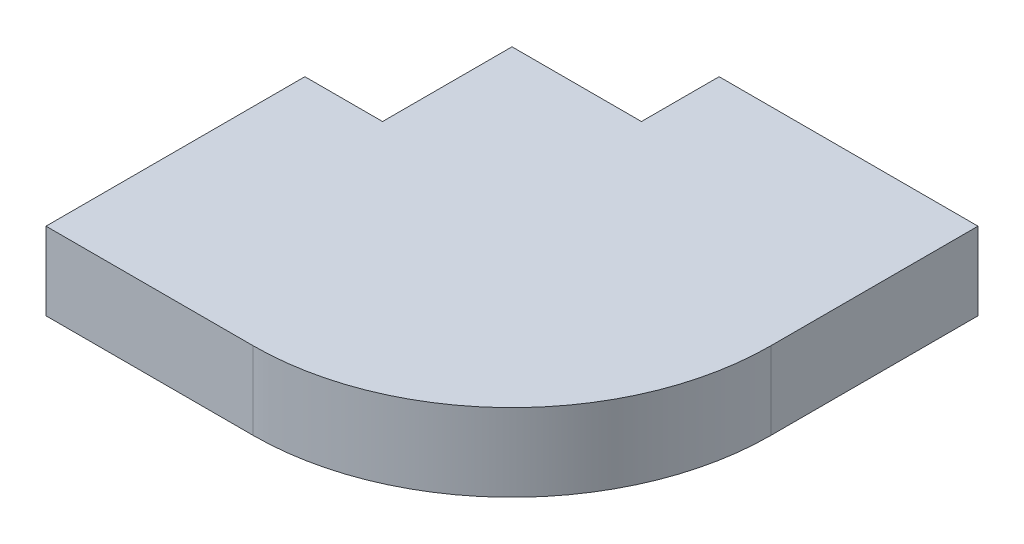
ISO-10303-21;
HEADER;
FILE_DESCRIPTION(('STEP AP214'),'2;1');
FILE_NAME('part.step','',(''),(''),'','','');
FILE_SCHEMA(('AUTOMOTIVE_DESIGN { 1 0 10303 214 1 1 1 1 }'));
ENDSEC;
DATA;
#1=APPLICATION_CONTEXT('core data for automotive mechanical design processes');
#2=APPLICATION_PROTOCOL_DEFINITION('international standard','automotive_design',2000,#1);
#3=PRODUCT_CONTEXT('',#1,'mechanical');
#4=PRODUCT('Part','Part','',(#3));
#5=PRODUCT_RELATED_PRODUCT_CATEGORY('part','',(#4));
#6=PRODUCT_DEFINITION_FORMATION('','',#4);
#7=PRODUCT_DEFINITION_CONTEXT('part definition',#1,'design');
#8=PRODUCT_DEFINITION('design','',#6,#7);
#9=PRODUCT_DEFINITION_SHAPE('','',#8);
#10=(LENGTH_UNIT() NAMED_UNIT(*) SI_UNIT(.MILLI.,.METRE.));
#11=(NAMED_UNIT(*) PLANE_ANGLE_UNIT() SI_UNIT($,.RADIAN.));
#12=(NAMED_UNIT(*) SI_UNIT($,.STERADIAN.) SOLID_ANGLE_UNIT());
#13=UNCERTAINTY_MEASURE_WITH_UNIT(LENGTH_MEASURE(1.E-05),#10,'distance_accuracy_value','');
#14=(GEOMETRIC_REPRESENTATION_CONTEXT(3) GLOBAL_UNCERTAINTY_ASSIGNED_CONTEXT((#13)) GLOBAL_UNIT_ASSIGNED_CONTEXT((#10,
#11,#12)) REPRESENTATION_CONTEXT('',''));
#15=CARTESIAN_POINT('',(0.,0.,0.));
#16=DIRECTION('',(0.,0.,1.));
#17=DIRECTION('',(1.,0.,0.));
#18=AXIS2_PLACEMENT_3D('',#15,#16,#17);
#19=CARTESIAN_POINT('',(-2.5,3.,-10.5));
#20=DIRECTION('',(0.,0.,1.));
#21=DIRECTION('',(1.,0.,0.));
#22=AXIS2_PLACEMENT_3D('',#19,#20,#21);
#23=PLANE('',#22);
#24=DIRECTION('',(-1.,0.,0.));
#25=VECTOR('',#24,1.);
#26=CARTESIAN_POINT('',(-2.5,0.,-10.5));
#27=LINE('',#26,#25);
#28=CARTESIAN_POINT('',(7.5,0.,-10.5));
#29=VERTEX_POINT('',#28);
#30=CARTESIAN_POINT('',(-2.5,0.,-10.5));
#31=VERTEX_POINT('',#30);
#32=EDGE_CURVE('E139',#29,#31,#27,.T.);
#33=ORIENTED_EDGE('',*,*,#32,.T.);
#34=DIRECTION('',(0.,-1.,0.));
#35=VECTOR('',#34,1.);
#36=CARTESIAN_POINT('',(-2.5,3.,-10.5));
#37=LINE('',#36,#35);
#38=CARTESIAN_POINT('',(-2.5,3.,-10.5));
#39=VERTEX_POINT('',#38);
#40=EDGE_CURVE('E41',#39,#31,#37,.T.);
#41=ORIENTED_EDGE('',*,*,#40,.F.);
#42=DIRECTION('',(-1.,0.,0.));
#43=VECTOR('',#42,1.);
#44=CARTESIAN_POINT('',(-2.5,3.,-10.5));
#45=LINE('',#44,#43);
#46=CARTESIAN_POINT('',(7.5,3.,-10.5));
#47=VERTEX_POINT('',#46);
#48=EDGE_CURVE('E95',#47,#39,#45,.T.);
#49=ORIENTED_EDGE('',*,*,#48,.F.);
#50=DIRECTION('',(0.,-1.,0.));
#51=VECTOR('',#50,1.);
#52=CARTESIAN_POINT('',(7.5,3.,-10.5));
#53=LINE('',#52,#51);
#54=EDGE_CURVE('E11',#47,#29,#53,.T.);
#55=ORIENTED_EDGE('',*,*,#54,.T.);
#56=EDGE_LOOP('',(#33,#41,#49,#55));
#57=FACE_BOUND('',#56,.T.);
#58=ADVANCED_FACE('F33',(#57),#23,.F.);
#59=CARTESIAN_POINT('',(-2.5,3.,-7.5));
#60=DIRECTION('',(1.,0.,0.));
#61=DIRECTION('',(0.,0.,-1.));
#62=AXIS2_PLACEMENT_3D('',#59,#60,#61);
#63=PLANE('',#62);
#64=DIRECTION('',(0.,0.,1.));
#65=VECTOR('',#64,1.);
#66=CARTESIAN_POINT('',(-2.5,0.,-7.5));
#67=LINE('',#66,#65);
#68=CARTESIAN_POINT('',(-2.5,0.,-7.5));
#69=VERTEX_POINT('',#68);
#70=EDGE_CURVE('E141',#31,#69,#67,.T.);
#71=ORIENTED_EDGE('',*,*,#70,.T.);
#72=DIRECTION('',(0.,-1.,0.));
#73=VECTOR('',#72,1.);
#74=CARTESIAN_POINT('',(-2.5,3.,-7.5));
#75=LINE('',#74,#73);
#76=CARTESIAN_POINT('',(-2.5,3.,-7.5));
#77=VERTEX_POINT('',#76);
#78=EDGE_CURVE('E163',#77,#69,#75,.T.);
#79=ORIENTED_EDGE('',*,*,#78,.F.);
#80=DIRECTION('',(0.,0.,1.));
#81=VECTOR('',#80,1.);
#82=CARTESIAN_POINT('',(-2.5,3.,-7.5));
#83=LINE('',#82,#81);
#84=EDGE_CURVE('E171',#39,#77,#83,.T.);
#85=ORIENTED_EDGE('',*,*,#84,.F.);
#86=ORIENTED_EDGE('',*,*,#40,.T.);
#87=EDGE_LOOP('',(#71,#79,#85,#86));
#88=FACE_BOUND('',#87,.T.);
#89=ADVANCED_FACE('F169',(#88),#63,.F.);
#90=CARTESIAN_POINT('',(-7.5,3.,-7.5));
#91=DIRECTION('',(0.,0.,1.));
#92=DIRECTION('',(1.,0.,0.));
#93=AXIS2_PLACEMENT_3D('',#90,#91,#92);
#94=PLANE('',#93);
#95=DIRECTION('',(-1.,0.,0.));
#96=VECTOR('',#95,1.);
#97=CARTESIAN_POINT('',(-7.5,0.,-7.5));
#98=LINE('',#97,#96);
#99=CARTESIAN_POINT('',(-7.5,0.,-7.5));
#100=VERTEX_POINT('',#99);
#101=EDGE_CURVE('E143',#69,#100,#98,.T.);
#102=ORIENTED_EDGE('',*,*,#101,.T.);
#103=DIRECTION('',(0.,-1.,0.));
#104=VECTOR('',#103,1.);
#105=CARTESIAN_POINT('',(-7.5,3.,-7.5));
#106=LINE('',#105,#104);
#107=CARTESIAN_POINT('',(-7.5,3.,-7.5));
#108=VERTEX_POINT('',#107);
#109=EDGE_CURVE('E160',#108,#100,#106,.T.);
#110=ORIENTED_EDGE('',*,*,#109,.F.);
#111=DIRECTION('',(-1.,0.,0.));
#112=VECTOR('',#111,1.);
#113=CARTESIAN_POINT('',(-7.5,3.,-7.5));
#114=LINE('',#113,#112);
#115=EDGE_CURVE('E188',#77,#108,#114,.T.);
#116=ORIENTED_EDGE('',*,*,#115,.F.);
#117=ORIENTED_EDGE('',*,*,#78,.T.);
#118=EDGE_LOOP('',(#102,#110,#116,#117));
#119=FACE_BOUND('',#118,.T.);
#120=ADVANCED_FACE('F181',(#119),#94,.F.);
#121=CARTESIAN_POINT('',(-7.5,3.,-2.5));
#122=DIRECTION('',(1.,0.,0.));
#123=DIRECTION('',(0.,0.,-1.));
#124=AXIS2_PLACEMENT_3D('',#121,#122,#123);
#125=PLANE('',#124);
#126=DIRECTION('',(0.,0.,1.));
#127=VECTOR('',#126,1.);
#128=CARTESIAN_POINT('',(-7.5,0.,-2.5));
#129=LINE('',#128,#127);
#130=CARTESIAN_POINT('',(-7.5,0.,-2.5));
#131=VERTEX_POINT('',#130);
#132=EDGE_CURVE('E145',#100,#131,#129,.T.);
#133=ORIENTED_EDGE('',*,*,#132,.T.);
#134=DIRECTION('',(0.,-1.,0.));
#135=VECTOR('',#134,1.);
#136=CARTESIAN_POINT('',(-7.5,3.,-2.5));
#137=LINE('',#136,#135);
#138=CARTESIAN_POINT('',(-7.5,3.,-2.5));
#139=VERTEX_POINT('',#138);
#140=EDGE_CURVE('E157',#139,#131,#137,.T.);
#141=ORIENTED_EDGE('',*,*,#140,.F.);
#142=DIRECTION('',(0.,0.,1.));
#143=VECTOR('',#142,1.);
#144=CARTESIAN_POINT('',(-7.5,3.,-2.5));
#145=LINE('',#144,#143);
#146=EDGE_CURVE('E187',#108,#139,#145,.T.);
#147=ORIENTED_EDGE('',*,*,#146,.F.);
#148=ORIENTED_EDGE('',*,*,#109,.T.);
#149=EDGE_LOOP('',(#133,#141,#147,#148));
#150=FACE_BOUND('',#149,.T.);
#151=ADVANCED_FACE('F185',(#150),#125,.F.);
#152=CARTESIAN_POINT('',(-7.5,3.,-2.5));
#153=DIRECTION('',(0.,0.,1.));
#154=DIRECTION('',(1.,0.,0.));
#155=AXIS2_PLACEMENT_3D('',#152,#153,#154);
#156=PLANE('',#155);
#157=DIRECTION('',(-1.,0.,0.));
#158=VECTOR('',#157,1.);
#159=CARTESIAN_POINT('',(-7.5,0.,-2.5));
#160=LINE('',#159,#158);
#161=CARTESIAN_POINT('',(-10.5,0.,-2.5));
#162=VERTEX_POINT('',#161);
#163=EDGE_CURVE('E147',#131,#162,#160,.T.);
#164=ORIENTED_EDGE('',*,*,#163,.T.);
#165=DIRECTION('',(0.,-1.,0.));
#166=VECTOR('',#165,1.);
#167=CARTESIAN_POINT('',(-10.5,3.,-2.5));
#168=LINE('',#167,#166);
#169=CARTESIAN_POINT('',(-10.5,3.,-2.5));
#170=VERTEX_POINT('',#169);
#171=EDGE_CURVE('E128',#170,#162,#168,.T.);
#172=ORIENTED_EDGE('',*,*,#171,.F.);
#173=DIRECTION('',(-1.,0.,0.));
#174=VECTOR('',#173,1.);
#175=CARTESIAN_POINT('',(-7.5,3.,-2.5));
#176=LINE('',#175,#174);
#177=EDGE_CURVE('E118',#139,#170,#176,.T.);
#178=ORIENTED_EDGE('',*,*,#177,.F.);
#179=ORIENTED_EDGE('',*,*,#140,.T.);
#180=EDGE_LOOP('',(#164,#172,#178,#179));
#181=FACE_BOUND('',#180,.T.);
#182=ADVANCED_FACE('F206',(#181),#156,.F.);
#183=CARTESIAN_POINT('',(-10.5,3.,-2.5));
#184=DIRECTION('',(1.,0.,0.));
#185=DIRECTION('',(0.,0.,-1.));
#186=AXIS2_PLACEMENT_3D('',#183,#184,#185);
#187=PLANE('',#186);
#188=DIRECTION('',(0.,0.,1.));
#189=VECTOR('',#188,1.);
#190=CARTESIAN_POINT('',(-10.5,0.,-2.5));
#191=LINE('',#190,#189);
#192=CARTESIAN_POINT('',(-10.5,0.,7.5));
#193=VERTEX_POINT('',#192);
#194=EDGE_CURVE('E127',#162,#193,#191,.T.);
#195=ORIENTED_EDGE('',*,*,#194,.T.);
#196=DIRECTION('',(0.,-1.,0.));
#197=VECTOR('',#196,1.);
#198=CARTESIAN_POINT('',(-10.5,3.,7.5));
#199=LINE('',#198,#197);
#200=CARTESIAN_POINT('',(-10.5,3.,7.5));
#201=VERTEX_POINT('',#200);
#202=EDGE_CURVE('E124',#201,#193,#199,.T.);
#203=ORIENTED_EDGE('',*,*,#202,.F.);
#204=DIRECTION('',(0.,0.,1.));
#205=VECTOR('',#204,1.);
#206=CARTESIAN_POINT('',(-10.5,3.,-2.5));
#207=LINE('',#206,#205);
#208=EDGE_CURVE('E112',#170,#201,#207,.T.);
#209=ORIENTED_EDGE('',*,*,#208,.F.);
#210=ORIENTED_EDGE('',*,*,#171,.T.);
#211=EDGE_LOOP('',(#195,#203,#209,#210));
#212=FACE_BOUND('',#211,.T.);
#213=ADVANCED_FACE('F125',(#212),#187,.F.);
#214=CARTESIAN_POINT('',(-7.5,3.,7.5));
#215=DIRECTION('',(0.,0.,-1.));
#216=DIRECTION('',(-1.,0.,0.));
#217=AXIS2_PLACEMENT_3D('',#214,#215,#216);
#218=PLANE('',#217);
#219=DIRECTION('',(1.,0.,0.));
#220=VECTOR('',#219,1.);
#221=CARTESIAN_POINT('',(-7.5,0.,7.5));
#222=LINE('',#221,#220);
#223=CARTESIAN_POINT('',(-2.50000000000007,0.,7.5));
#224=VERTEX_POINT('',#223);
#225=EDGE_CURVE('E81',#193,#224,#222,.T.);
#226=ORIENTED_EDGE('',*,*,#225,.T.);
#227=DIRECTION('',(0.,-1.,0.));
#228=VECTOR('',#227,1.);
#229=CARTESIAN_POINT('',(-2.50000000000007,3.,7.5));
#230=LINE('',#229,#228);
#231=CARTESIAN_POINT('',(-2.50000000000007,3.,7.5));
#232=VERTEX_POINT('',#231);
#233=EDGE_CURVE('E129',#232,#224,#230,.T.);
#234=ORIENTED_EDGE('',*,*,#233,.F.);
#235=DIRECTION('',(1.,0.,0.));
#236=VECTOR('',#235,1.);
#237=CARTESIAN_POINT('',(-10.5,3.,7.5));
#238=LINE('',#237,#236);
#239=EDGE_CURVE('E116',#201,#232,#238,.T.);
#240=ORIENTED_EDGE('',*,*,#239,.F.);
#241=ORIENTED_EDGE('',*,*,#202,.T.);
#242=EDGE_LOOP('',(#226,#234,#240,#241));
#243=FACE_BOUND('',#242,.T.);
#244=ADVANCED_FACE('F131',(#243),#218,.F.);
#245=CARTESIAN_POINT('',(-2.5,3.,-2.5));
#246=DIRECTION('',(0.,-1.,0.));
#247=DIRECTION('',(0.,0.,-1.));
#248=AXIS2_PLACEMENT_3D('',#245,#246,#247);
#249=CYLINDRICAL_SURFACE('',#248,10.);
#250=CARTESIAN_POINT('',(-2.5,0.,-2.5));
#251=DIRECTION('',(0.,1.,0.));
#252=DIRECTION('',(0.,0.,1.));
#253=AXIS2_PLACEMENT_3D('',#250,#251,#252);
#254=CIRCLE('',#253,10.);
#255=CARTESIAN_POINT('',(7.5,0.,-2.50000000000007));
#256=VERTEX_POINT('',#255);
#257=EDGE_CURVE('E88',#224,#256,#254,.T.);
#258=ORIENTED_EDGE('',*,*,#257,.T.);
#259=DIRECTION('',(0.,-1.,0.));
#260=VECTOR('',#259,1.);
#261=CARTESIAN_POINT('',(7.5,3.,-2.50000000000007));
#262=LINE('',#261,#260);
#263=CARTESIAN_POINT('',(7.5,3.,-2.50000000000007));
#264=VERTEX_POINT('',#263);
#265=EDGE_CURVE('E135',#264,#256,#262,.T.);
#266=ORIENTED_EDGE('',*,*,#265,.F.);
#267=CARTESIAN_POINT('',(-2.5,3.,-2.5));
#268=DIRECTION('',(0.,1.,0.));
#269=DIRECTION('',(0.,0.,1.));
#270=AXIS2_PLACEMENT_3D('',#267,#268,#269);
#271=CIRCLE('',#270,10.);
#272=EDGE_CURVE('E133',#232,#264,#271,.T.);
#273=ORIENTED_EDGE('',*,*,#272,.F.);
#274=ORIENTED_EDGE('',*,*,#233,.T.);
#275=EDGE_LOOP('',(#258,#266,#273,#274));
#276=FACE_BOUND('',#275,.T.);
#277=ADVANCED_FACE('F214',(#276),#249,.T.);
#278=CARTESIAN_POINT('',(7.5,3.,-2.50000000000007));
#279=DIRECTION('',(-1.,0.,0.));
#280=DIRECTION('',(0.,0.,1.));
#281=AXIS2_PLACEMENT_3D('',#278,#279,#280);
#282=PLANE('',#281);
#283=DIRECTION('',(0.,0.,-1.));
#284=VECTOR('',#283,1.);
#285=CARTESIAN_POINT('',(7.5,0.,-2.50000000000007));
#286=LINE('',#285,#284);
#287=EDGE_CURVE('E152',#256,#29,#286,.T.);
#288=ORIENTED_EDGE('',*,*,#287,.T.);
#289=ORIENTED_EDGE('',*,*,#54,.F.);
#290=DIRECTION('',(0.,0.,-1.));
#291=VECTOR('',#290,1.);
#292=CARTESIAN_POINT('',(7.5,3.,-10.5));
#293=LINE('',#292,#291);
#294=EDGE_CURVE('E49',#264,#47,#293,.T.);
#295=ORIENTED_EDGE('',*,*,#294,.F.);
#296=ORIENTED_EDGE('',*,*,#265,.T.);
#297=EDGE_LOOP('',(#288,#289,#295,#296));
#298=FACE_BOUND('',#297,.T.);
#299=ADVANCED_FACE('F194',(#298),#282,.F.);
#300=CARTESIAN_POINT('',(-2.5,3.,-2.5));
#301=DIRECTION('',(0.,1.,0.));
#302=DIRECTION('',(0.,0.,1.));
#303=AXIS2_PLACEMENT_3D('',#300,#301,#302);
#304=PLANE('',#303);
#305=ORIENTED_EDGE('',*,*,#294,.T.);
#306=ORIENTED_EDGE('',*,*,#48,.T.);
#307=ORIENTED_EDGE('',*,*,#84,.T.);
#308=ORIENTED_EDGE('',*,*,#115,.T.);
#309=ORIENTED_EDGE('',*,*,#146,.T.);
#310=ORIENTED_EDGE('',*,*,#177,.T.);
#311=ORIENTED_EDGE('',*,*,#208,.T.);
#312=ORIENTED_EDGE('',*,*,#239,.T.);
#313=ORIENTED_EDGE('',*,*,#272,.T.);
#314=EDGE_LOOP('',(#305,#306,#307,#308,#309,#310,#311,#312,#313));
#315=FACE_BOUND('',#314,.T.);
#316=ADVANCED_FACE('F114',(#315),#304,.T.);
#317=CARTESIAN_POINT('',(-2.5,0.,-2.5));
#318=DIRECTION('',(0.,1.,0.));
#319=DIRECTION('',(0.,0.,1.));
#320=AXIS2_PLACEMENT_3D('',#317,#318,#319);
#321=PLANE('',#320);
#322=ORIENTED_EDGE('',*,*,#32,.F.);
#323=ORIENTED_EDGE('',*,*,#287,.F.);
#324=ORIENTED_EDGE('',*,*,#257,.F.);
#325=ORIENTED_EDGE('',*,*,#225,.F.);
#326=ORIENTED_EDGE('',*,*,#194,.F.);
#327=ORIENTED_EDGE('',*,*,#163,.F.);
#328=ORIENTED_EDGE('',*,*,#132,.F.);
#329=ORIENTED_EDGE('',*,*,#101,.F.);
#330=ORIENTED_EDGE('',*,*,#70,.F.);
#331=EDGE_LOOP('',(#322,#323,#324,#325,#326,#327,#328,#329,#330));
#332=FACE_BOUND('',#331,.T.);
#333=ADVANCED_FACE('F175',(#332),#321,.F.);
#334=CLOSED_SHELL('',(#58,#89,#120,#151,#182,#213,#244,#277,#299,#316,#333));
#335=MANIFOLD_SOLID_BREP('B2',#334);
#336=ADVANCED_BREP_SHAPE_REPRESENTATION('',(#18,#335),#14);
#337=SHAPE_DEFINITION_REPRESENTATION(#9,#336);
ENDSEC;
END-ISO-10303-21;
